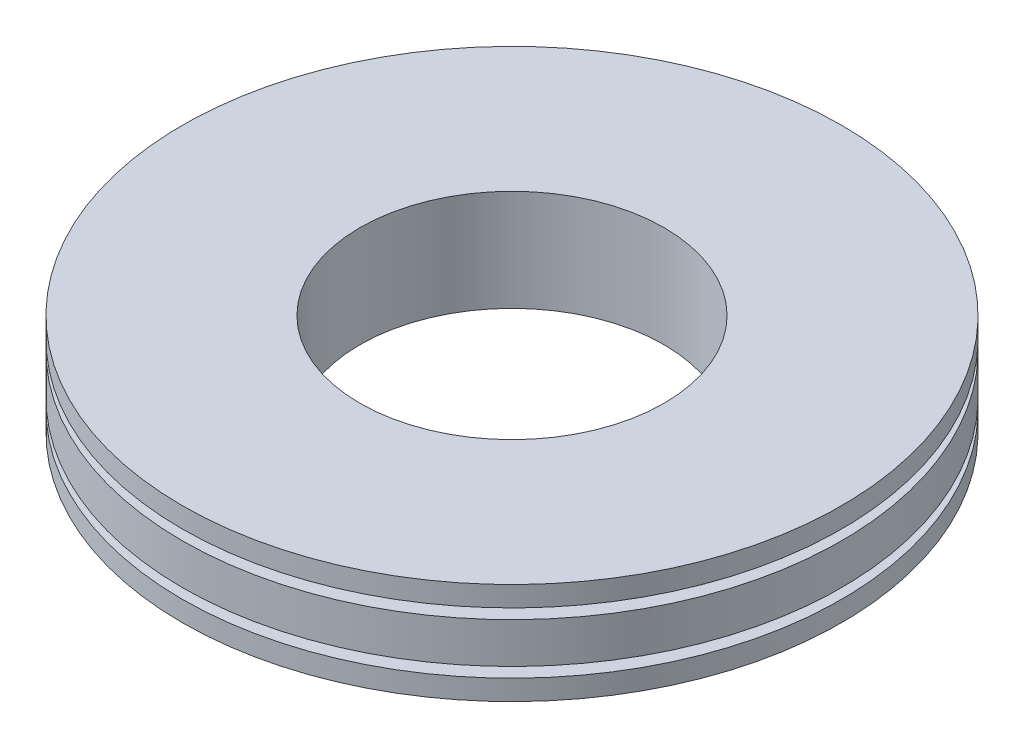
ISO-10303-21;
HEADER;
FILE_DESCRIPTION(('STEP AP214'),'2;1');
FILE_NAME('part.step','',(''),(''),'','','');
FILE_SCHEMA(('AUTOMOTIVE_DESIGN { 1 0 10303 214 1 1 1 1 }'));
ENDSEC;
DATA;
#1=APPLICATION_CONTEXT('core data for automotive mechanical design processes');
#2=APPLICATION_PROTOCOL_DEFINITION('international standard','automotive_design',2000,#1);
#3=PRODUCT_CONTEXT('',#1,'mechanical');
#4=PRODUCT('Part','Part','',(#3));
#5=PRODUCT_RELATED_PRODUCT_CATEGORY('part','',(#4));
#6=PRODUCT_DEFINITION_FORMATION('','',#4);
#7=PRODUCT_DEFINITION_CONTEXT('part definition',#1,'design');
#8=PRODUCT_DEFINITION('design','',#6,#7);
#9=PRODUCT_DEFINITION_SHAPE('','',#8);
#10=(LENGTH_UNIT() NAMED_UNIT(*) SI_UNIT(.MILLI.,.METRE.));
#11=(NAMED_UNIT(*) PLANE_ANGLE_UNIT() SI_UNIT($,.RADIAN.));
#12=(NAMED_UNIT(*) SI_UNIT($,.STERADIAN.) SOLID_ANGLE_UNIT());
#13=UNCERTAINTY_MEASURE_WITH_UNIT(LENGTH_MEASURE(1.E-05),#10,'distance_accuracy_value','');
#14=(GEOMETRIC_REPRESENTATION_CONTEXT(3) GLOBAL_UNCERTAINTY_ASSIGNED_CONTEXT((#13)) GLOBAL_UNIT_ASSIGNED_CONTEXT((#10,
#11,#12)) REPRESENTATION_CONTEXT('',''));
#15=CARTESIAN_POINT('',(0.,0.,0.));
#16=DIRECTION('',(0.,0.,1.));
#17=DIRECTION('',(1.,0.,0.));
#18=AXIS2_PLACEMENT_3D('',#15,#16,#17);
#19=CARTESIAN_POINT('',(0.,4.,0.));
#20=DIRECTION('',(0.,-1.,0.));
#21=DIRECTION('',(0.,0.,-1.));
#22=AXIS2_PLACEMENT_3D('',#19,#20,#21);
#23=CYLINDRICAL_SURFACE('',#22,13.);
#24=CARTESIAN_POINT('',(0.,4.,0.));
#25=DIRECTION('',(0.,1.,0.));
#26=DIRECTION('',(0.,0.,1.));
#27=AXIS2_PLACEMENT_3D('',#24,#25,#26);
#28=CIRCLE('',#27,13.);
#29=CARTESIAN_POINT('',(0.,4.,13.));
#30=VERTEX_POINT('',#29);
#31=EDGE_CURVE('E10',#30,#30,#28,.T.);
#32=ORIENTED_EDGE('',*,*,#31,.F.);
#33=EDGE_LOOP('',(#32));
#34=FACE_BOUND('',#33,.T.);
#35=CARTESIAN_POINT('',(0.,3.2,0.));
#36=DIRECTION('',(0.,-1.,0.));
#37=DIRECTION('',(0.,0.,-1.));
#38=AXIS2_PLACEMENT_3D('',#35,#36,#37);
#39=CIRCLE('',#38,13.);
#40=CARTESIAN_POINT('',(0.,3.2,-13.));
#41=VERTEX_POINT('',#40);
#42=EDGE_CURVE('E74',#41,#41,#39,.T.);
#43=ORIENTED_EDGE('',*,*,#42,.F.);
#44=EDGE_LOOP('',(#43));
#45=FACE_BOUND('',#44,.T.);
#46=ADVANCED_FACE('F43',(#34,#45),#23,.T.);
#47=CARTESIAN_POINT('',(0.,2.8,0.));
#48=DIRECTION('',(0.,-1.,0.));
#49=DIRECTION('',(0.,0.,-1.));
#50=AXIS2_PLACEMENT_3D('',#47,#48,#49);
#51=CIRCLE('',#50,13.);
#52=CARTESIAN_POINT('',(0.,2.8,-13.));
#53=VERTEX_POINT('',#52);
#54=EDGE_CURVE('E71',#53,#53,#51,.T.);
#55=ORIENTED_EDGE('',*,*,#54,.T.);
#56=EDGE_LOOP('',(#55));
#57=FACE_BOUND('',#56,.T.);
#58=CARTESIAN_POINT('',(0.,1.2,0.));
#59=DIRECTION('',(0.,-1.,0.));
#60=DIRECTION('',(0.,0.,-1.));
#61=AXIS2_PLACEMENT_3D('',#58,#59,#60);
#62=CIRCLE('',#61,13.);
#63=CARTESIAN_POINT('',(0.,1.2,-13.));
#64=VERTEX_POINT('',#63);
#65=EDGE_CURVE('E59',#64,#64,#62,.T.);
#66=ORIENTED_EDGE('',*,*,#65,.F.);
#67=EDGE_LOOP('',(#66));
#68=FACE_BOUND('',#67,.T.);
#69=ADVANCED_FACE('F106',(#57,#68),#23,.T.);
#70=CARTESIAN_POINT('',(0.,0.8,0.));
#71=DIRECTION('',(0.,-1.,0.));
#72=DIRECTION('',(0.,0.,-1.));
#73=AXIS2_PLACEMENT_3D('',#70,#71,#72);
#74=CIRCLE('',#73,13.);
#75=CARTESIAN_POINT('',(0.,0.8,-13.));
#76=VERTEX_POINT('',#75);
#77=EDGE_CURVE('E62',#76,#76,#74,.T.);
#78=ORIENTED_EDGE('',*,*,#77,.T.);
#79=EDGE_LOOP('',(#78));
#80=FACE_BOUND('',#79,.T.);
#81=CARTESIAN_POINT('',(0.,0.,0.));
#82=DIRECTION('',(0.,1.,0.));
#83=DIRECTION('',(0.,0.,1.));
#84=AXIS2_PLACEMENT_3D('',#81,#82,#83);
#85=CIRCLE('',#84,13.);
#86=CARTESIAN_POINT('',(0.,0.,13.));
#87=VERTEX_POINT('',#86);
#88=EDGE_CURVE('E47',#87,#87,#85,.T.);
#89=ORIENTED_EDGE('',*,*,#88,.T.);
#90=EDGE_LOOP('',(#89));
#91=FACE_BOUND('',#90,.T.);
#92=ADVANCED_FACE('F45',(#80,#91),#23,.T.);
#93=CARTESIAN_POINT('',(0.,4.,0.));
#94=DIRECTION('',(0.,1.,0.));
#95=DIRECTION('',(0.,0.,1.));
#96=AXIS2_PLACEMENT_3D('',#93,#94,#95);
#97=PLANE('',#96);
#98=CARTESIAN_POINT('',(0.,4.,0.));
#99=DIRECTION('',(0.,-1.,0.));
#100=DIRECTION('',(0.,0.,-1.));
#101=AXIS2_PLACEMENT_3D('',#98,#99,#100);
#102=CIRCLE('',#101,6.);
#103=CARTESIAN_POINT('',(0.,4.,-6.));
#104=VERTEX_POINT('',#103);
#105=EDGE_CURVE('E54',#104,#104,#102,.T.);
#106=ORIENTED_EDGE('',*,*,#105,.T.);
#107=EDGE_LOOP('',(#106));
#108=FACE_BOUND('',#107,.T.);
#109=ORIENTED_EDGE('',*,*,#31,.T.);
#110=EDGE_LOOP('',(#109));
#111=FACE_BOUND('',#110,.T.);
#112=ADVANCED_FACE('F115',(#108,#111),#97,.T.);
#113=CARTESIAN_POINT('',(0.,0.,0.));
#114=DIRECTION('',(0.,1.,0.));
#115=DIRECTION('',(0.,0.,1.));
#116=AXIS2_PLACEMENT_3D('',#113,#114,#115);
#117=PLANE('',#116);
#118=CARTESIAN_POINT('',(0.,0.,0.));
#119=DIRECTION('',(0.,-1.,0.));
#120=DIRECTION('',(0.,0.,-1.));
#121=AXIS2_PLACEMENT_3D('',#118,#119,#120);
#122=CIRCLE('',#121,6.);
#123=CARTESIAN_POINT('',(0.,0.,-6.));
#124=VERTEX_POINT('',#123);
#125=EDGE_CURVE('E56',#124,#124,#122,.T.);
#126=ORIENTED_EDGE('',*,*,#125,.F.);
#127=EDGE_LOOP('',(#126));
#128=FACE_BOUND('',#127,.T.);
#129=ORIENTED_EDGE('',*,*,#88,.F.);
#130=EDGE_LOOP('',(#129));
#131=FACE_BOUND('',#130,.T.);
#132=ADVANCED_FACE('F122',(#128,#131),#117,.F.);
#133=CARTESIAN_POINT('',(0.,4.,0.));
#134=DIRECTION('',(0.,-1.,0.));
#135=DIRECTION('',(0.,0.,-1.));
#136=AXIS2_PLACEMENT_3D('',#133,#134,#135);
#137=CYLINDRICAL_SURFACE('',#136,6.);
#138=ORIENTED_EDGE('',*,*,#105,.F.);
#139=EDGE_LOOP('',(#138));
#140=FACE_BOUND('',#139,.T.);
#141=ORIENTED_EDGE('',*,*,#125,.T.);
#142=EDGE_LOOP('',(#141));
#143=FACE_BOUND('',#142,.T.);
#144=ADVANCED_FACE('F130',(#140,#143),#137,.F.);
#145=CARTESIAN_POINT('',(0.,1.2,0.));
#146=DIRECTION('',(0.,-1.,0.));
#147=DIRECTION('',(0.,0.,-1.));
#148=AXIS2_PLACEMENT_3D('',#145,#146,#147);
#149=PLANE('',#148);
#150=CARTESIAN_POINT('',(0.,1.2,0.));
#151=DIRECTION('',(0.,-1.,0.));
#152=DIRECTION('',(0.,0.,-1.));
#153=AXIS2_PLACEMENT_3D('',#150,#151,#152);
#154=CIRCLE('',#153,12.);
#155=CARTESIAN_POINT('',(0.,1.2,-12.));
#156=VERTEX_POINT('',#155);
#157=EDGE_CURVE('E65',#156,#156,#154,.T.);
#158=ORIENTED_EDGE('',*,*,#157,.F.);
#159=EDGE_LOOP('',(#158));
#160=FACE_BOUND('',#159,.T.);
#161=ORIENTED_EDGE('',*,*,#65,.T.);
#162=EDGE_LOOP('',(#161));
#163=FACE_BOUND('',#162,.T.);
#164=ADVANCED_FACE('F134',(#160,#163),#149,.T.);
#165=CARTESIAN_POINT('',(0.,0.8,0.));
#166=DIRECTION('',(0.,-1.,0.));
#167=DIRECTION('',(0.,0.,-1.));
#168=AXIS2_PLACEMENT_3D('',#165,#166,#167);
#169=PLANE('',#168);
#170=CARTESIAN_POINT('',(0.,0.8,0.));
#171=DIRECTION('',(0.,-1.,0.));
#172=DIRECTION('',(0.,0.,-1.));
#173=AXIS2_PLACEMENT_3D('',#170,#171,#172);
#174=CIRCLE('',#173,12.);
#175=CARTESIAN_POINT('',(0.,0.8,-12.));
#176=VERTEX_POINT('',#175);
#177=EDGE_CURVE('E68',#176,#176,#174,.T.);
#178=ORIENTED_EDGE('',*,*,#177,.T.);
#179=EDGE_LOOP('',(#178));
#180=FACE_BOUND('',#179,.T.);
#181=ORIENTED_EDGE('',*,*,#77,.F.);
#182=EDGE_LOOP('',(#181));
#183=FACE_BOUND('',#182,.T.);
#184=ADVANCED_FACE('F139',(#180,#183),#169,.F.);
#185=CARTESIAN_POINT('',(0.,1.2,0.));
#186=DIRECTION('',(0.,-1.,0.));
#187=DIRECTION('',(0.,0.,-1.));
#188=AXIS2_PLACEMENT_3D('',#185,#186,#187);
#189=CYLINDRICAL_SURFACE('',#188,12.);
#190=ORIENTED_EDGE('',*,*,#157,.T.);
#191=EDGE_LOOP('',(#190));
#192=FACE_BOUND('',#191,.T.);
#193=ORIENTED_EDGE('',*,*,#177,.F.);
#194=EDGE_LOOP('',(#193));
#195=FACE_BOUND('',#194,.T.);
#196=ADVANCED_FACE('F101',(#192,#195),#189,.T.);
#197=CARTESIAN_POINT('',(0.,2.8,0.));
#198=DIRECTION('',(0.,-1.,0.));
#199=DIRECTION('',(0.,0.,-1.));
#200=AXIS2_PLACEMENT_3D('',#197,#198,#199);
#201=PLANE('',#200);
#202=ORIENTED_EDGE('',*,*,#54,.F.);
#203=EDGE_LOOP('',(#202));
#204=FACE_BOUND('',#203,.T.);
#205=CARTESIAN_POINT('',(0.,2.8,0.));
#206=DIRECTION('',(0.,-1.,0.));
#207=DIRECTION('',(0.,0.,-1.));
#208=AXIS2_PLACEMENT_3D('',#205,#206,#207);
#209=CIRCLE('',#208,12.);
#210=CARTESIAN_POINT('',(0.,2.8,-12.));
#211=VERTEX_POINT('',#210);
#212=EDGE_CURVE('E77',#211,#211,#209,.T.);
#213=ORIENTED_EDGE('',*,*,#212,.T.);
#214=EDGE_LOOP('',(#213));
#215=FACE_BOUND('',#214,.T.);
#216=ADVANCED_FACE('F86',(#204,#215),#201,.F.);
#217=CARTESIAN_POINT('',(0.,3.2,0.));
#218=DIRECTION('',(0.,-1.,0.));
#219=DIRECTION('',(0.,0.,-1.));
#220=AXIS2_PLACEMENT_3D('',#217,#218,#219);
#221=PLANE('',#220);
#222=ORIENTED_EDGE('',*,*,#42,.T.);
#223=EDGE_LOOP('',(#222));
#224=FACE_BOUND('',#223,.T.);
#225=CARTESIAN_POINT('',(0.,3.2,0.));
#226=DIRECTION('',(0.,-1.,0.));
#227=DIRECTION('',(0.,0.,-1.));
#228=AXIS2_PLACEMENT_3D('',#225,#226,#227);
#229=CIRCLE('',#228,12.);
#230=CARTESIAN_POINT('',(0.,3.2,-12.));
#231=VERTEX_POINT('',#230);
#232=EDGE_CURVE('E80',#231,#231,#229,.T.);
#233=ORIENTED_EDGE('',*,*,#232,.F.);
#234=EDGE_LOOP('',(#233));
#235=FACE_BOUND('',#234,.T.);
#236=ADVANCED_FACE('F91',(#224,#235),#221,.T.);
#237=CARTESIAN_POINT('',(0.,2.8,0.));
#238=DIRECTION('',(0.,1.,0.));
#239=DIRECTION('',(0.,0.,1.));
#240=AXIS2_PLACEMENT_3D('',#237,#238,#239);
#241=CYLINDRICAL_SURFACE('',#240,12.);
#242=ORIENTED_EDGE('',*,*,#212,.F.);
#243=EDGE_LOOP('',(#242));
#244=FACE_BOUND('',#243,.T.);
#245=ORIENTED_EDGE('',*,*,#232,.T.);
#246=EDGE_LOOP('',(#245));
#247=FACE_BOUND('',#246,.T.);
#248=ADVANCED_FACE('F88',(#244,#247),#241,.T.);
#249=CLOSED_SHELL('',(#46,#69,#92,#112,#132,#144,#164,#184,#196,#216,#236,#248));
#250=MANIFOLD_SOLID_BREP('B2',#249);
#251=ADVANCED_BREP_SHAPE_REPRESENTATION('',(#18,#250),#14);
#252=SHAPE_DEFINITION_REPRESENTATION(#9,#251);
ENDSEC;
END-ISO-10303-21;
